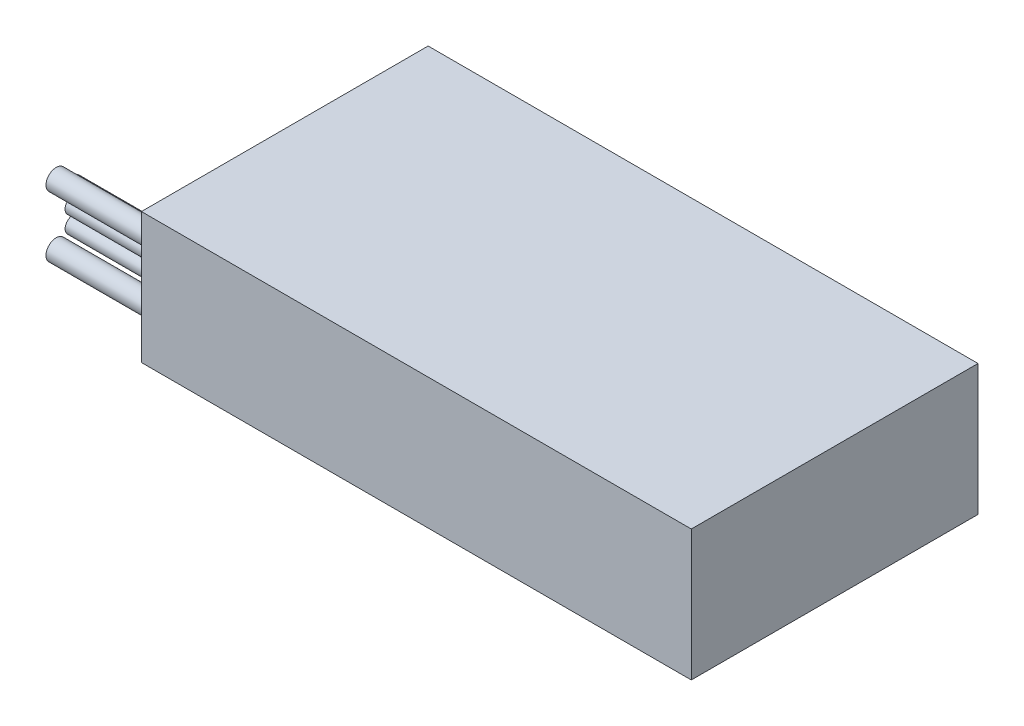
ISO-10303-21;
HEADER;
FILE_DESCRIPTION(('STEP AP214'),'2;1');
FILE_NAME('part.step','',(''),(''),'','','');
FILE_SCHEMA(('AUTOMOTIVE_DESIGN { 1 0 10303 214 1 1 1 1 }'));
ENDSEC;
DATA;
#1=APPLICATION_CONTEXT('core data for automotive mechanical design processes');
#2=APPLICATION_PROTOCOL_DEFINITION('international standard','automotive_design',2000,#1);
#3=PRODUCT_CONTEXT('',#1,'mechanical');
#4=PRODUCT('Part','Part','',(#3));
#5=PRODUCT_RELATED_PRODUCT_CATEGORY('part','',(#4));
#6=PRODUCT_DEFINITION_FORMATION('','',#4);
#7=PRODUCT_DEFINITION_CONTEXT('part definition',#1,'design');
#8=PRODUCT_DEFINITION('design','',#6,#7);
#9=PRODUCT_DEFINITION_SHAPE('','',#8);
#10=(LENGTH_UNIT() NAMED_UNIT(*) SI_UNIT(.MILLI.,.METRE.));
#11=(NAMED_UNIT(*) PLANE_ANGLE_UNIT() SI_UNIT($,.RADIAN.));
#12=(NAMED_UNIT(*) SI_UNIT($,.STERADIAN.) SOLID_ANGLE_UNIT());
#13=UNCERTAINTY_MEASURE_WITH_UNIT(LENGTH_MEASURE(1.E-05),#10,'distance_accuracy_value','');
#14=(GEOMETRIC_REPRESENTATION_CONTEXT(3) GLOBAL_UNCERTAINTY_ASSIGNED_CONTEXT((#13)) GLOBAL_UNIT_ASSIGNED_CONTEXT((#10,
#11,#12)) REPRESENTATION_CONTEXT('',''));
#15=CARTESIAN_POINT('',(0.,0.,0.));
#16=DIRECTION('',(0.,0.,1.));
#17=DIRECTION('',(1.,0.,0.));
#18=AXIS2_PLACEMENT_3D('',#15,#16,#17);
#19=CARTESIAN_POINT('',(0.,0.,35.3));
#20=DIRECTION('',(1.,0.,0.));
#21=DIRECTION('',(0.,0.,-1.));
#22=AXIS2_PLACEMENT_3D('',#19,#20,#21);
#23=PLANE('',#22);
#24=CARTESIAN_POINT('',(0.,11.8,32.8));
#25=DIRECTION('',(1.,0.,0.));
#26=DIRECTION('',(0.,0.,-1.));
#27=AXIS2_PLACEMENT_3D('',#24,#25,#26);
#28=CIRCLE('',#27,1.25);
#29=CARTESIAN_POINT('',(0.,11.8,31.55));
#30=VERTEX_POINT('',#29);
#31=EDGE_CURVE('E11',#30,#30,#28,.F.);
#32=ORIENTED_EDGE('',*,*,#31,.F.);
#33=EDGE_LOOP('',(#32));
#34=FACE_BOUND('',#33,.T.);
#35=CARTESIAN_POINT('',(0.,4.3,32.8));
#36=DIRECTION('',(1.,0.,0.));
#37=DIRECTION('',(0.,0.,-1.));
#38=AXIS2_PLACEMENT_3D('',#35,#36,#37);
#39=CIRCLE('',#38,1.25);
#40=CARTESIAN_POINT('',(0.,4.3,31.55));
#41=VERTEX_POINT('',#40);
#42=EDGE_CURVE('E47',#41,#41,#39,.F.);
#43=ORIENTED_EDGE('',*,*,#42,.F.);
#44=EDGE_LOOP('',(#43));
#45=FACE_BOUND('',#44,.T.);
#46=CARTESIAN_POINT('',(0.,5.95,30.7));
#47=DIRECTION('',(1.,0.,0.));
#48=DIRECTION('',(0.,0.,-1.));
#49=AXIS2_PLACEMENT_3D('',#46,#47,#48);
#50=CIRCLE('',#49,0.999999999999987);
#51=CARTESIAN_POINT('',(0.,5.95,29.7));
#52=VERTEX_POINT('',#51);
#53=EDGE_CURVE('E122',#52,#52,#50,.F.);
#54=ORIENTED_EDGE('',*,*,#53,.F.);
#55=EDGE_LOOP('',(#54));
#56=FACE_BOUND('',#55,.T.);
#57=CARTESIAN_POINT('',(0.,8.05,30.7));
#58=DIRECTION('',(1.,0.,0.));
#59=DIRECTION('',(0.,0.,-1.));
#60=AXIS2_PLACEMENT_3D('',#57,#58,#59);
#61=CIRCLE('',#60,0.999999999999987);
#62=CARTESIAN_POINT('',(0.,8.05,29.7));
#63=VERTEX_POINT('',#62);
#64=EDGE_CURVE('E119',#63,#63,#61,.F.);
#65=ORIENTED_EDGE('',*,*,#64,.F.);
#66=EDGE_LOOP('',(#65));
#67=FACE_BOUND('',#66,.T.);
#68=CARTESIAN_POINT('',(0.,10.15,30.7));
#69=DIRECTION('',(1.,0.,0.));
#70=DIRECTION('',(0.,0.,-1.));
#71=AXIS2_PLACEMENT_3D('',#68,#69,#70);
#72=CIRCLE('',#71,0.999999999999987);
#73=CARTESIAN_POINT('',(0.,10.15,29.7));
#74=VERTEX_POINT('',#73);
#75=EDGE_CURVE('E116',#74,#74,#72,.F.);
#76=ORIENTED_EDGE('',*,*,#75,.F.);
#77=EDGE_LOOP('',(#76));
#78=FACE_BOUND('',#77,.T.);
#79=DIRECTION('',(0.,-1.,0.));
#80=VECTOR('',#79,1.);
#81=CARTESIAN_POINT('',(0.,0.,0.));
#82=LINE('',#81,#80);
#83=CARTESIAN_POINT('',(0.,16.1,0.));
#84=VERTEX_POINT('',#83);
#85=CARTESIAN_POINT('',(0.,0.,0.));
#86=VERTEX_POINT('',#85);
#87=EDGE_CURVE('E106',#84,#86,#82,.T.);
#88=ORIENTED_EDGE('',*,*,#87,.T.);
#89=DIRECTION('',(0.,0.,-1.));
#90=VECTOR('',#89,1.);
#91=CARTESIAN_POINT('',(0.,0.,35.3));
#92=LINE('',#91,#90);
#93=CARTESIAN_POINT('',(0.,0.,35.3));
#94=VERTEX_POINT('',#93);
#95=EDGE_CURVE('E97',#94,#86,#92,.T.);
#96=ORIENTED_EDGE('',*,*,#95,.F.);
#97=DIRECTION('',(0.,-1.,0.));
#98=VECTOR('',#97,1.);
#99=CARTESIAN_POINT('',(0.,0.,35.3));
#100=LINE('',#99,#98);
#101=CARTESIAN_POINT('',(0.,16.1,35.3));
#102=VERTEX_POINT('',#101);
#103=EDGE_CURVE('E91',#102,#94,#100,.T.);
#104=ORIENTED_EDGE('',*,*,#103,.F.);
#105=DIRECTION('',(0.,0.,-1.));
#106=VECTOR('',#105,1.);
#107=CARTESIAN_POINT('',(0.,16.1,35.3));
#108=LINE('',#107,#106);
#109=EDGE_CURVE('E102',#102,#84,#108,.T.);
#110=ORIENTED_EDGE('',*,*,#109,.T.);
#111=EDGE_LOOP('',(#88,#96,#104,#110));
#112=FACE_BOUND('',#111,.T.);
#113=ADVANCED_FACE('F39',(#34,#45,#56,#67,#78,#112),#23,.F.);
#114=CARTESIAN_POINT('',(0.,0.,35.3));
#115=DIRECTION('',(0.,1.,0.));
#116=DIRECTION('',(0.,0.,1.));
#117=AXIS2_PLACEMENT_3D('',#114,#115,#116);
#118=PLANE('',#117);
#119=DIRECTION('',(1.,0.,0.));
#120=VECTOR('',#119,1.);
#121=CARTESIAN_POINT('',(0.,0.,0.));
#122=LINE('',#121,#120);
#123=CARTESIAN_POINT('',(67.7,0.,0.));
#124=VERTEX_POINT('',#123);
#125=EDGE_CURVE('E96',#86,#124,#122,.T.);
#126=ORIENTED_EDGE('',*,*,#125,.T.);
#127=DIRECTION('',(0.,0.,-1.));
#128=VECTOR('',#127,1.);
#129=CARTESIAN_POINT('',(67.7,0.,35.3));
#130=LINE('',#129,#128);
#131=CARTESIAN_POINT('',(67.7,0.,35.3));
#132=VERTEX_POINT('',#131);
#133=EDGE_CURVE('E94',#132,#124,#130,.T.);
#134=ORIENTED_EDGE('',*,*,#133,.F.);
#135=DIRECTION('',(1.,0.,0.));
#136=VECTOR('',#135,1.);
#137=CARTESIAN_POINT('',(0.,0.,35.3));
#138=LINE('',#137,#136);
#139=EDGE_CURVE('E86',#94,#132,#138,.T.);
#140=ORIENTED_EDGE('',*,*,#139,.F.);
#141=ORIENTED_EDGE('',*,*,#95,.T.);
#142=EDGE_LOOP('',(#126,#134,#140,#141));
#143=FACE_BOUND('',#142,.T.);
#144=ADVANCED_FACE('F95',(#143),#118,.F.);
#145=CARTESIAN_POINT('',(67.7,0.,35.3));
#146=DIRECTION('',(-1.,0.,0.));
#147=DIRECTION('',(0.,0.,1.));
#148=AXIS2_PLACEMENT_3D('',#145,#146,#147);
#149=PLANE('',#148);
#150=DIRECTION('',(0.,1.,0.));
#151=VECTOR('',#150,1.);
#152=CARTESIAN_POINT('',(67.7,0.,0.));
#153=LINE('',#152,#151);
#154=CARTESIAN_POINT('',(67.7,16.1,0.));
#155=VERTEX_POINT('',#154);
#156=EDGE_CURVE('E72',#124,#155,#153,.T.);
#157=ORIENTED_EDGE('',*,*,#156,.T.);
#158=DIRECTION('',(0.,0.,-1.));
#159=VECTOR('',#158,1.);
#160=CARTESIAN_POINT('',(67.7,16.1,35.3));
#161=LINE('',#160,#159);
#162=CARTESIAN_POINT('',(67.7,16.1,35.3));
#163=VERTEX_POINT('',#162);
#164=EDGE_CURVE('E98',#163,#155,#161,.T.);
#165=ORIENTED_EDGE('',*,*,#164,.F.);
#166=DIRECTION('',(0.,1.,0.));
#167=VECTOR('',#166,1.);
#168=CARTESIAN_POINT('',(67.7,0.,35.3));
#169=LINE('',#168,#167);
#170=EDGE_CURVE('E89',#132,#163,#169,.T.);
#171=ORIENTED_EDGE('',*,*,#170,.F.);
#172=ORIENTED_EDGE('',*,*,#133,.T.);
#173=EDGE_LOOP('',(#157,#165,#171,#172));
#174=FACE_BOUND('',#173,.T.);
#175=ADVANCED_FACE('F100',(#174),#149,.F.);
#176=CARTESIAN_POINT('',(0.,16.1,35.3));
#177=DIRECTION('',(0.,-1.,0.));
#178=DIRECTION('',(0.,0.,-1.));
#179=AXIS2_PLACEMENT_3D('',#176,#177,#178);
#180=PLANE('',#179);
#181=DIRECTION('',(-1.,0.,0.));
#182=VECTOR('',#181,1.);
#183=CARTESIAN_POINT('',(0.,16.1,0.));
#184=LINE('',#183,#182);
#185=EDGE_CURVE('E78',#155,#84,#184,.T.);
#186=ORIENTED_EDGE('',*,*,#185,.T.);
#187=ORIENTED_EDGE('',*,*,#109,.F.);
#188=DIRECTION('',(-1.,0.,0.));
#189=VECTOR('',#188,1.);
#190=CARTESIAN_POINT('',(0.,16.1,35.3));
#191=LINE('',#190,#189);
#192=EDGE_CURVE('E55',#163,#102,#191,.T.);
#193=ORIENTED_EDGE('',*,*,#192,.F.);
#194=ORIENTED_EDGE('',*,*,#164,.T.);
#195=EDGE_LOOP('',(#186,#187,#193,#194));
#196=FACE_BOUND('',#195,.T.);
#197=ADVANCED_FACE('F151',(#196),#180,.F.);
#198=CARTESIAN_POINT('',(0.,0.,35.3));
#199=DIRECTION('',(0.,0.,-1.));
#200=DIRECTION('',(-1.,0.,0.));
#201=AXIS2_PLACEMENT_3D('',#198,#199,#200);
#202=PLANE('',#201);
#203=ORIENTED_EDGE('',*,*,#103,.T.);
#204=ORIENTED_EDGE('',*,*,#139,.T.);
#205=ORIENTED_EDGE('',*,*,#170,.T.);
#206=ORIENTED_EDGE('',*,*,#192,.T.);
#207=EDGE_LOOP('',(#203,#204,#205,#206));
#208=FACE_BOUND('',#207,.T.);
#209=ADVANCED_FACE('F87',(#208),#202,.F.);
#210=CARTESIAN_POINT('',(0.,0.,0.));
#211=DIRECTION('',(0.,0.,-1.));
#212=DIRECTION('',(-1.,0.,0.));
#213=AXIS2_PLACEMENT_3D('',#210,#211,#212);
#214=PLANE('',#213);
#215=ORIENTED_EDGE('',*,*,#87,.F.);
#216=ORIENTED_EDGE('',*,*,#185,.F.);
#217=ORIENTED_EDGE('',*,*,#156,.F.);
#218=ORIENTED_EDGE('',*,*,#125,.F.);
#219=EDGE_LOOP('',(#215,#216,#217,#218));
#220=FACE_BOUND('',#219,.T.);
#221=ADVANCED_FACE('F140',(#220),#214,.T.);
#222=CARTESIAN_POINT('',(-13.,10.15,30.7));
#223=DIRECTION('',(1.,0.,0.));
#224=DIRECTION('',(0.,0.,-1.));
#225=AXIS2_PLACEMENT_3D('',#222,#223,#224);
#226=CYLINDRICAL_SURFACE('',#225,0.999999999999987);
#227=CARTESIAN_POINT('',(-13.,10.15,30.7));
#228=DIRECTION('',(-1.,0.,0.));
#229=DIRECTION('',(0.,0.,1.));
#230=AXIS2_PLACEMENT_3D('',#227,#228,#229);
#231=CIRCLE('',#230,0.999999999999987);
#232=CARTESIAN_POINT('',(-13.,10.15,29.7));
#233=VERTEX_POINT('',#232);
#234=EDGE_CURVE('E109',#233,#233,#231,.T.);
#235=CARTESIAN_POINT('',(-13.,10.15,29.7));
#236=CARTESIAN_POINT('',(-12.8645833333333,10.15,29.7));
#237=CARTESIAN_POINT('',(-12.7291666666667,10.15,29.7));
#238=CARTESIAN_POINT('',(-12.4583333333333,10.15,29.7));
#239=CARTESIAN_POINT('',(-12.3229166666667,10.15,29.7));
#240=CARTESIAN_POINT('',(-12.0520833333333,10.15,29.7));
#241=CARTESIAN_POINT('',(-11.9166666666667,10.15,29.7));
#242=CARTESIAN_POINT('',(-11.6458333333333,10.15,29.7));
#243=CARTESIAN_POINT('',(-11.5104166666667,10.15,29.7));
#244=CARTESIAN_POINT('',(-11.2395833333333,10.15,29.7));
#245=CARTESIAN_POINT('',(-11.1041666666667,10.15,29.7));
#246=CARTESIAN_POINT('',(-10.8333333333333,10.15,29.7));
#247=CARTESIAN_POINT('',(-10.6979166666667,10.15,29.7));
#248=CARTESIAN_POINT('',(-10.4270833333333,10.15,29.7));
#249=CARTESIAN_POINT('',(-10.2916666666667,10.15,29.7));
#250=CARTESIAN_POINT('',(-10.0208333333333,10.15,29.7));
#251=CARTESIAN_POINT('',(-9.88541666666667,10.15,29.7));
#252=CARTESIAN_POINT('',(-9.61458333333333,10.15,29.7));
#253=CARTESIAN_POINT('',(-9.47916666666667,10.15,29.7));
#254=CARTESIAN_POINT('',(-9.20833333333333,10.15,29.7));
#255=CARTESIAN_POINT('',(-9.07291666666666,10.15,29.7));
#256=CARTESIAN_POINT('',(-8.80208333333333,10.15,29.7));
#257=CARTESIAN_POINT('',(-8.66666666666667,10.15,29.7));
#258=CARTESIAN_POINT('',(-8.39583333333333,10.15,29.7));
#259=CARTESIAN_POINT('',(-8.26041666666667,10.15,29.7));
#260=CARTESIAN_POINT('',(-7.98958333333333,10.15,29.7));
#261=CARTESIAN_POINT('',(-7.85416666666667,10.15,29.7));
#262=CARTESIAN_POINT('',(-7.58333333333333,10.15,29.7));
#263=CARTESIAN_POINT('',(-7.44791666666667,10.15,29.7));
#264=CARTESIAN_POINT('',(-7.17708333333333,10.15,29.7));
#265=CARTESIAN_POINT('',(-7.04166666666667,10.15,29.7));
#266=CARTESIAN_POINT('',(-6.77083333333333,10.15,29.7));
#267=CARTESIAN_POINT('',(-6.63541666666667,10.15,29.7));
#268=CARTESIAN_POINT('',(-6.36458333333333,10.15,29.7));
#269=CARTESIAN_POINT('',(-6.22916666666667,10.15,29.7));
#270=CARTESIAN_POINT('',(-5.95833333333333,10.15,29.7));
#271=CARTESIAN_POINT('',(-5.82291666666667,10.15,29.7));
#272=CARTESIAN_POINT('',(-5.55208333333333,10.15,29.7));
#273=CARTESIAN_POINT('',(-5.41666666666667,10.15,29.7));
#274=CARTESIAN_POINT('',(-5.14583333333333,10.15,29.7));
#275=CARTESIAN_POINT('',(-5.01041666666667,10.15,29.7));
#276=CARTESIAN_POINT('',(-4.73958333333333,10.15,29.7));
#277=CARTESIAN_POINT('',(-4.60416666666667,10.15,29.7));
#278=CARTESIAN_POINT('',(-4.33333333333333,10.15,29.7));
#279=CARTESIAN_POINT('',(-4.19791666666667,10.15,29.7));
#280=CARTESIAN_POINT('',(-3.92708333333333,10.15,29.7));
#281=CARTESIAN_POINT('',(-3.79166666666667,10.15,29.7));
#282=CARTESIAN_POINT('',(-3.52083333333333,10.15,29.7));
#283=CARTESIAN_POINT('',(-3.38541666666667,10.15,29.7));
#284=CARTESIAN_POINT('',(-3.11458333333333,10.15,29.7));
#285=CARTESIAN_POINT('',(-2.97916666666667,10.15,29.7));
#286=CARTESIAN_POINT('',(-2.70833333333333,10.15,29.7));
#287=CARTESIAN_POINT('',(-2.57291666666667,10.15,29.7));
#288=CARTESIAN_POINT('',(-2.30208333333333,10.15,29.7));
#289=CARTESIAN_POINT('',(-2.16666666666667,10.15,29.7));
#290=CARTESIAN_POINT('',(-1.89583333333333,10.15,29.7));
#291=CARTESIAN_POINT('',(-1.76041666666667,10.15,29.7));
#292=CARTESIAN_POINT('',(-1.48958333333333,10.15,29.7));
#293=CARTESIAN_POINT('',(-1.35416666666667,10.15,29.7));
#294=CARTESIAN_POINT('',(-1.08333333333333,10.15,29.7));
#295=CARTESIAN_POINT('',(-0.947916666666667,10.15,29.7));
#296=CARTESIAN_POINT('',(-0.677083333333334,10.15,29.7));
#297=CARTESIAN_POINT('',(-0.541666666666667,10.15,29.7));
#298=CARTESIAN_POINT('',(-0.270833333333334,10.15,29.7));
#299=CARTESIAN_POINT('',(-0.135416666666667,10.15,29.7));
#300=CARTESIAN_POINT('',(0.,10.15,29.7));
#301=B_SPLINE_CURVE_WITH_KNOTS('',3,(#235,#236,#237,#238,#239,#240,#241,#242,#243,#244,#245,
#246,#247,#248,#249,#250,#251,#252,#253,#254,#255,#256,#257,#258,#259,#260,#261,#262,#263,#264,
#265,#266,#267,#268,#269,#270,#271,#272,#273,#274,#275,#276,#277,#278,#279,#280,#281,#282,#283,
#284,#285,#286,#287,#288,#289,#290,#291,#292,#293,#294,#295,#296,#297,#298,#299,#300),
.UNSPECIFIED.,.F.,.F.,(4,2,2,2,2,2,2,2,2,2,2,2,2,2,2,2,2,2,2,2,2,2,2,2,2,2,2,2,2,2,2,2,4),(0.,
0.40625,0.812500000000001,1.21875,1.625,2.03125,2.4375,2.84375,3.25,3.65625,4.0625,4.46875,
4.875,5.28125,5.6875,6.09375,6.5,6.90625,7.3125,7.71875,8.125,8.53125,8.9375,9.34375,9.75,
10.15625,10.5625,10.96875,11.375,11.78125,12.1875,12.59375,13.),.UNSPECIFIED.);
#302=EDGE_CURVE('BSEAM142',#233,#74,#301,.T.);
#303=ORIENTED_EDGE('',*,*,#234,.F.);
#304=ORIENTED_EDGE('',*,*,#75,.T.);
#305=ORIENTED_EDGE('',*,*,#302,.T.);
#306=ORIENTED_EDGE('',*,*,#302,.F.);
#307=EDGE_LOOP('',(#303,#305,#304,#306));
#308=FACE_BOUND('',#307,.T.);
#309=ADVANCED_FACE('F142',(#308),#226,.T.);
#310=CARTESIAN_POINT('',(-13.,10.15,30.7));
#311=DIRECTION('',(-1.,0.,0.));
#312=DIRECTION('',(0.,0.,1.));
#313=AXIS2_PLACEMENT_3D('',#310,#311,#312);
#314=PLANE('',#313);
#315=ORIENTED_EDGE('',*,*,#234,.T.);
#316=EDGE_LOOP('',(#315));
#317=FACE_BOUND('',#316,.T.);
#318=ADVANCED_FACE('F148',(#317),#314,.T.);
#319=CARTESIAN_POINT('',(-13.,8.05,30.7));
#320=DIRECTION('',(1.,0.,0.));
#321=DIRECTION('',(0.,0.,-1.));
#322=AXIS2_PLACEMENT_3D('',#319,#320,#321);
#323=CYLINDRICAL_SURFACE('',#322,0.999999999999987);
#324=CARTESIAN_POINT('',(-13.,8.05,30.7));
#325=DIRECTION('',(-1.,0.,0.));
#326=DIRECTION('',(0.,0.,1.));
#327=AXIS2_PLACEMENT_3D('',#324,#325,#326);
#328=CIRCLE('',#327,0.999999999999987);
#329=CARTESIAN_POINT('',(-13.,8.05,29.7));
#330=VERTEX_POINT('',#329);
#331=EDGE_CURVE('E291',#330,#330,#328,.T.);
#332=CARTESIAN_POINT('',(-13.,8.05,29.7));
#333=CARTESIAN_POINT('',(-12.8645833333333,8.05,29.7));
#334=CARTESIAN_POINT('',(-12.7291666666667,8.05,29.7));
#335=CARTESIAN_POINT('',(-12.4583333333333,8.05,29.7));
#336=CARTESIAN_POINT('',(-12.3229166666667,8.05,29.7));
#337=CARTESIAN_POINT('',(-12.0520833333333,8.05,29.7));
#338=CARTESIAN_POINT('',(-11.9166666666667,8.05,29.7));
#339=CARTESIAN_POINT('',(-11.6458333333333,8.05,29.7));
#340=CARTESIAN_POINT('',(-11.5104166666667,8.05,29.7));
#341=CARTESIAN_POINT('',(-11.2395833333333,8.05,29.7));
#342=CARTESIAN_POINT('',(-11.1041666666667,8.05,29.7));
#343=CARTESIAN_POINT('',(-10.8333333333333,8.05,29.7));
#344=CARTESIAN_POINT('',(-10.6979166666667,8.05,29.7));
#345=CARTESIAN_POINT('',(-10.4270833333333,8.05,29.7));
#346=CARTESIAN_POINT('',(-10.2916666666667,8.05,29.7));
#347=CARTESIAN_POINT('',(-10.0208333333333,8.05,29.7));
#348=CARTESIAN_POINT('',(-9.88541666666667,8.05,29.7));
#349=CARTESIAN_POINT('',(-9.61458333333333,8.05,29.7));
#350=CARTESIAN_POINT('',(-9.47916666666667,8.05,29.7));
#351=CARTESIAN_POINT('',(-9.20833333333333,8.05,29.7));
#352=CARTESIAN_POINT('',(-9.07291666666666,8.05,29.7));
#353=CARTESIAN_POINT('',(-8.80208333333333,8.05,29.7));
#354=CARTESIAN_POINT('',(-8.66666666666667,8.05,29.7));
#355=CARTESIAN_POINT('',(-8.39583333333333,8.05,29.7));
#356=CARTESIAN_POINT('',(-8.26041666666667,8.05,29.7));
#357=CARTESIAN_POINT('',(-7.98958333333333,8.05,29.7));
#358=CARTESIAN_POINT('',(-7.85416666666667,8.05,29.7));
#359=CARTESIAN_POINT('',(-7.58333333333333,8.05,29.7));
#360=CARTESIAN_POINT('',(-7.44791666666667,8.05,29.7));
#361=CARTESIAN_POINT('',(-7.17708333333333,8.05,29.7));
#362=CARTESIAN_POINT('',(-7.04166666666667,8.05,29.7));
#363=CARTESIAN_POINT('',(-6.77083333333333,8.05,29.7));
#364=CARTESIAN_POINT('',(-6.63541666666667,8.05,29.7));
#365=CARTESIAN_POINT('',(-6.36458333333333,8.05,29.7));
#366=CARTESIAN_POINT('',(-6.22916666666667,8.05,29.7));
#367=CARTESIAN_POINT('',(-5.95833333333333,8.05,29.7));
#368=CARTESIAN_POINT('',(-5.82291666666667,8.05,29.7));
#369=CARTESIAN_POINT('',(-5.55208333333333,8.05,29.7));
#370=CARTESIAN_POINT('',(-5.41666666666667,8.05,29.7));
#371=CARTESIAN_POINT('',(-5.14583333333333,8.05,29.7));
#372=CARTESIAN_POINT('',(-5.01041666666667,8.05,29.7));
#373=CARTESIAN_POINT('',(-4.73958333333333,8.05,29.7));
#374=CARTESIAN_POINT('',(-4.60416666666667,8.05,29.7));
#375=CARTESIAN_POINT('',(-4.33333333333333,8.05,29.7));
#376=CARTESIAN_POINT('',(-4.19791666666667,8.05,29.7));
#377=CARTESIAN_POINT('',(-3.92708333333333,8.05,29.7));
#378=CARTESIAN_POINT('',(-3.79166666666667,8.05,29.7));
#379=CARTESIAN_POINT('',(-3.52083333333333,8.05,29.7));
#380=CARTESIAN_POINT('',(-3.38541666666667,8.05,29.7));
#381=CARTESIAN_POINT('',(-3.11458333333333,8.05,29.7));
#382=CARTESIAN_POINT('',(-2.97916666666667,8.05,29.7));
#383=CARTESIAN_POINT('',(-2.70833333333333,8.05,29.7));
#384=CARTESIAN_POINT('',(-2.57291666666667,8.05,29.7));
#385=CARTESIAN_POINT('',(-2.30208333333333,8.05,29.7));
#386=CARTESIAN_POINT('',(-2.16666666666667,8.05,29.7));
#387=CARTESIAN_POINT('',(-1.89583333333333,8.05,29.7));
#388=CARTESIAN_POINT('',(-1.76041666666667,8.05,29.7));
#389=CARTESIAN_POINT('',(-1.48958333333333,8.05,29.7));
#390=CARTESIAN_POINT('',(-1.35416666666667,8.05,29.7));
#391=CARTESIAN_POINT('',(-1.08333333333333,8.05,29.7));
#392=CARTESIAN_POINT('',(-0.947916666666667,8.05,29.7));
#393=CARTESIAN_POINT('',(-0.677083333333334,8.05,29.7));
#394=CARTESIAN_POINT('',(-0.541666666666667,8.05,29.7));
#395=CARTESIAN_POINT('',(-0.270833333333334,8.05,29.7));
#396=CARTESIAN_POINT('',(-0.135416666666667,8.05,29.7));
#397=CARTESIAN_POINT('',(0.,8.05,29.7));
#398=B_SPLINE_CURVE_WITH_KNOTS('',3,(#332,#333,#334,#335,#336,#337,#338,#339,#340,#341,#342,
#343,#344,#345,#346,#347,#348,#349,#350,#351,#352,#353,#354,#355,#356,#357,#358,#359,#360,#361,
#362,#363,#364,#365,#366,#367,#368,#369,#370,#371,#372,#373,#374,#375,#376,#377,#378,#379,#380,
#381,#382,#383,#384,#385,#386,#387,#388,#389,#390,#391,#392,#393,#394,#395,#396,#397),
.UNSPECIFIED.,.F.,.F.,(4,2,2,2,2,2,2,2,2,2,2,2,2,2,2,2,2,2,2,2,2,2,2,2,2,2,2,2,2,2,2,2,4),(0.,
0.40625,0.812500000000001,1.21875,1.625,2.03125,2.4375,2.84375,3.25,3.65625,4.0625,4.46875,
4.875,5.28125,5.6875,6.09375,6.5,6.90625,7.3125,7.71875,8.125,8.53125,8.9375,9.34375,9.75,
10.15625,10.5625,10.96875,11.375,11.78125,12.1875,12.59375,13.),.UNSPECIFIED.);
#399=EDGE_CURVE('BSEAM197',#330,#63,#398,.T.);
#400=ORIENTED_EDGE('',*,*,#331,.F.);
#401=ORIENTED_EDGE('',*,*,#64,.T.);
#402=ORIENTED_EDGE('',*,*,#399,.T.);
#403=ORIENTED_EDGE('',*,*,#399,.F.);
#404=EDGE_LOOP('',(#400,#402,#401,#403));
#405=FACE_BOUND('',#404,.T.);
#406=ADVANCED_FACE('F197',(#405),#323,.T.);
#407=CARTESIAN_POINT('',(-13.,8.05,30.7));
#408=DIRECTION('',(-1.,0.,0.));
#409=DIRECTION('',(0.,0.,1.));
#410=AXIS2_PLACEMENT_3D('',#407,#408,#409);
#411=PLANE('',#410);
#412=ORIENTED_EDGE('',*,*,#331,.T.);
#413=EDGE_LOOP('',(#412));
#414=FACE_BOUND('',#413,.T.);
#415=ADVANCED_FACE('F207',(#414),#411,.T.);
#416=CARTESIAN_POINT('',(-13.,5.95,30.7));
#417=DIRECTION('',(1.,0.,0.));
#418=DIRECTION('',(0.,0.,-1.));
#419=AXIS2_PLACEMENT_3D('',#416,#417,#418);
#420=CYLINDRICAL_SURFACE('',#419,0.999999999999987);
#421=CARTESIAN_POINT('',(-13.,5.95,30.7));
#422=DIRECTION('',(-1.,0.,0.));
#423=DIRECTION('',(0.,0.,1.));
#424=AXIS2_PLACEMENT_3D('',#421,#422,#423);
#425=CIRCLE('',#424,0.999999999999987);
#426=CARTESIAN_POINT('',(-13.,5.95,29.7));
#427=VERTEX_POINT('',#426);
#428=EDGE_CURVE('E286',#427,#427,#425,.T.);
#429=CARTESIAN_POINT('',(-13.,5.95,29.7));
#430=CARTESIAN_POINT('',(-12.8645833333333,5.95,29.7));
#431=CARTESIAN_POINT('',(-12.7291666666667,5.95,29.7));
#432=CARTESIAN_POINT('',(-12.4583333333333,5.95,29.7));
#433=CARTESIAN_POINT('',(-12.3229166666667,5.95,29.7));
#434=CARTESIAN_POINT('',(-12.0520833333333,5.95,29.7));
#435=CARTESIAN_POINT('',(-11.9166666666667,5.95,29.7));
#436=CARTESIAN_POINT('',(-11.6458333333333,5.95,29.7));
#437=CARTESIAN_POINT('',(-11.5104166666667,5.95,29.7));
#438=CARTESIAN_POINT('',(-11.2395833333333,5.95,29.7));
#439=CARTESIAN_POINT('',(-11.1041666666667,5.95,29.7));
#440=CARTESIAN_POINT('',(-10.8333333333333,5.95,29.7));
#441=CARTESIAN_POINT('',(-10.6979166666667,5.95,29.7));
#442=CARTESIAN_POINT('',(-10.4270833333333,5.95,29.7));
#443=CARTESIAN_POINT('',(-10.2916666666667,5.95,29.7));
#444=CARTESIAN_POINT('',(-10.0208333333333,5.95,29.7));
#445=CARTESIAN_POINT('',(-9.88541666666667,5.95,29.7));
#446=CARTESIAN_POINT('',(-9.61458333333333,5.95,29.7));
#447=CARTESIAN_POINT('',(-9.47916666666667,5.95,29.7));
#448=CARTESIAN_POINT('',(-9.20833333333333,5.95,29.7));
#449=CARTESIAN_POINT('',(-9.07291666666666,5.95,29.7));
#450=CARTESIAN_POINT('',(-8.80208333333333,5.95,29.7));
#451=CARTESIAN_POINT('',(-8.66666666666667,5.95,29.7));
#452=CARTESIAN_POINT('',(-8.39583333333333,5.95,29.7));
#453=CARTESIAN_POINT('',(-8.26041666666667,5.95,29.7));
#454=CARTESIAN_POINT('',(-7.98958333333333,5.95,29.7));
#455=CARTESIAN_POINT('',(-7.85416666666667,5.95,29.7));
#456=CARTESIAN_POINT('',(-7.58333333333333,5.95,29.7));
#457=CARTESIAN_POINT('',(-7.44791666666667,5.95,29.7));
#458=CARTESIAN_POINT('',(-7.17708333333333,5.95,29.7));
#459=CARTESIAN_POINT('',(-7.04166666666667,5.95,29.7));
#460=CARTESIAN_POINT('',(-6.77083333333333,5.95,29.7));
#461=CARTESIAN_POINT('',(-6.63541666666667,5.95,29.7));
#462=CARTESIAN_POINT('',(-6.36458333333333,5.95,29.7));
#463=CARTESIAN_POINT('',(-6.22916666666667,5.95,29.7));
#464=CARTESIAN_POINT('',(-5.95833333333333,5.95,29.7));
#465=CARTESIAN_POINT('',(-5.82291666666667,5.95,29.7));
#466=CARTESIAN_POINT('',(-5.55208333333333,5.95,29.7));
#467=CARTESIAN_POINT('',(-5.41666666666667,5.95,29.7));
#468=CARTESIAN_POINT('',(-5.14583333333333,5.95,29.7));
#469=CARTESIAN_POINT('',(-5.01041666666667,5.95,29.7));
#470=CARTESIAN_POINT('',(-4.73958333333333,5.95,29.7));
#471=CARTESIAN_POINT('',(-4.60416666666667,5.95,29.7));
#472=CARTESIAN_POINT('',(-4.33333333333333,5.95,29.7));
#473=CARTESIAN_POINT('',(-4.19791666666667,5.95,29.7));
#474=CARTESIAN_POINT('',(-3.92708333333333,5.95,29.7));
#475=CARTESIAN_POINT('',(-3.79166666666667,5.95,29.7));
#476=CARTESIAN_POINT('',(-3.52083333333333,5.95,29.7));
#477=CARTESIAN_POINT('',(-3.38541666666667,5.95,29.7));
#478=CARTESIAN_POINT('',(-3.11458333333333,5.95,29.7));
#479=CARTESIAN_POINT('',(-2.97916666666667,5.95,29.7));
#480=CARTESIAN_POINT('',(-2.70833333333333,5.95,29.7));
#481=CARTESIAN_POINT('',(-2.57291666666667,5.95,29.7));
#482=CARTESIAN_POINT('',(-2.30208333333333,5.95,29.7));
#483=CARTESIAN_POINT('',(-2.16666666666667,5.95,29.7));
#484=CARTESIAN_POINT('',(-1.89583333333333,5.95,29.7));
#485=CARTESIAN_POINT('',(-1.76041666666667,5.95,29.7));
#486=CARTESIAN_POINT('',(-1.48958333333333,5.95,29.7));
#487=CARTESIAN_POINT('',(-1.35416666666667,5.95,29.7));
#488=CARTESIAN_POINT('',(-1.08333333333333,5.95,29.7));
#489=CARTESIAN_POINT('',(-0.947916666666667,5.95,29.7));
#490=CARTESIAN_POINT('',(-0.677083333333334,5.95,29.7));
#491=CARTESIAN_POINT('',(-0.541666666666667,5.95,29.7));
#492=CARTESIAN_POINT('',(-0.270833333333334,5.95,29.7));
#493=CARTESIAN_POINT('',(-0.135416666666667,5.95,29.7));
#494=CARTESIAN_POINT('',(0.,5.95,29.7));
#495=B_SPLINE_CURVE_WITH_KNOTS('',3,(#429,#430,#431,#432,#433,#434,#435,#436,#437,#438,#439,
#440,#441,#442,#443,#444,#445,#446,#447,#448,#449,#450,#451,#452,#453,#454,#455,#456,#457,#458,
#459,#460,#461,#462,#463,#464,#465,#466,#467,#468,#469,#470,#471,#472,#473,#474,#475,#476,#477,
#478,#479,#480,#481,#482,#483,#484,#485,#486,#487,#488,#489,#490,#491,#492,#493,#494),
.UNSPECIFIED.,.F.,.F.,(4,2,2,2,2,2,2,2,2,2,2,2,2,2,2,2,2,2,2,2,2,2,2,2,2,2,2,2,2,2,2,2,4),(0.,
0.40625,0.812500000000001,1.21875,1.625,2.03125,2.4375,2.84375,3.25,3.65625,4.0625,4.46875,
4.875,5.28125,5.6875,6.09375,6.5,6.90625,7.3125,7.71875,8.125,8.53125,8.9375,9.34375,9.75,
10.15625,10.5625,10.96875,11.375,11.78125,12.1875,12.59375,13.),.UNSPECIFIED.);
#496=EDGE_CURVE('BSEAM217',#427,#52,#495,.T.);
#497=ORIENTED_EDGE('',*,*,#428,.F.);
#498=ORIENTED_EDGE('',*,*,#53,.T.);
#499=ORIENTED_EDGE('',*,*,#496,.T.);
#500=ORIENTED_EDGE('',*,*,#496,.F.);
#501=EDGE_LOOP('',(#497,#499,#498,#500));
#502=FACE_BOUND('',#501,.T.);
#503=ADVANCED_FACE('F217',(#502),#420,.T.);
#504=CARTESIAN_POINT('',(-13.,5.95,30.7));
#505=DIRECTION('',(-1.,0.,0.));
#506=DIRECTION('',(0.,0.,1.));
#507=AXIS2_PLACEMENT_3D('',#504,#505,#506);
#508=PLANE('',#507);
#509=ORIENTED_EDGE('',*,*,#428,.T.);
#510=EDGE_LOOP('',(#509));
#511=FACE_BOUND('',#510,.T.);
#512=ADVANCED_FACE('F227',(#511),#508,.T.);
#513=CARTESIAN_POINT('',(-13.,4.3,32.8));
#514=DIRECTION('',(1.,0.,0.));
#515=DIRECTION('',(0.,0.,-1.));
#516=AXIS2_PLACEMENT_3D('',#513,#514,#515);
#517=CYLINDRICAL_SURFACE('',#516,1.25);
#518=CARTESIAN_POINT('',(-13.,4.3,32.8));
#519=DIRECTION('',(-1.,0.,0.));
#520=DIRECTION('',(0.,0.,1.));
#521=AXIS2_PLACEMENT_3D('',#518,#519,#520);
#522=CIRCLE('',#521,1.25);
#523=CARTESIAN_POINT('',(-13.,4.3,31.55));
#524=VERTEX_POINT('',#523);
#525=EDGE_CURVE('E283',#524,#524,#522,.T.);
#526=CARTESIAN_POINT('',(-13.,4.3,31.55));
#527=CARTESIAN_POINT('',(-12.8645833333333,4.3,31.55));
#528=CARTESIAN_POINT('',(-12.7291666666667,4.3,31.55));
#529=CARTESIAN_POINT('',(-12.4583333333333,4.3,31.55));
#530=CARTESIAN_POINT('',(-12.3229166666667,4.3,31.55));
#531=CARTESIAN_POINT('',(-12.0520833333333,4.3,31.55));
#532=CARTESIAN_POINT('',(-11.9166666666667,4.3,31.55));
#533=CARTESIAN_POINT('',(-11.6458333333333,4.3,31.55));
#534=CARTESIAN_POINT('',(-11.5104166666667,4.3,31.55));
#535=CARTESIAN_POINT('',(-11.2395833333333,4.3,31.55));
#536=CARTESIAN_POINT('',(-11.1041666666667,4.3,31.55));
#537=CARTESIAN_POINT('',(-10.8333333333333,4.3,31.55));
#538=CARTESIAN_POINT('',(-10.6979166666667,4.3,31.55));
#539=CARTESIAN_POINT('',(-10.4270833333333,4.3,31.55));
#540=CARTESIAN_POINT('',(-10.2916666666667,4.3,31.55));
#541=CARTESIAN_POINT('',(-10.0208333333333,4.3,31.55));
#542=CARTESIAN_POINT('',(-9.88541666666667,4.3,31.55));
#543=CARTESIAN_POINT('',(-9.61458333333333,4.3,31.55));
#544=CARTESIAN_POINT('',(-9.47916666666667,4.3,31.55));
#545=CARTESIAN_POINT('',(-9.20833333333333,4.3,31.55));
#546=CARTESIAN_POINT('',(-9.07291666666666,4.3,31.55));
#547=CARTESIAN_POINT('',(-8.80208333333333,4.3,31.55));
#548=CARTESIAN_POINT('',(-8.66666666666667,4.3,31.55));
#549=CARTESIAN_POINT('',(-8.39583333333333,4.3,31.55));
#550=CARTESIAN_POINT('',(-8.26041666666667,4.3,31.55));
#551=CARTESIAN_POINT('',(-7.98958333333333,4.3,31.55));
#552=CARTESIAN_POINT('',(-7.85416666666667,4.3,31.55));
#553=CARTESIAN_POINT('',(-7.58333333333333,4.3,31.55));
#554=CARTESIAN_POINT('',(-7.44791666666667,4.3,31.55));
#555=CARTESIAN_POINT('',(-7.17708333333333,4.3,31.55));
#556=CARTESIAN_POINT('',(-7.04166666666667,4.3,31.55));
#557=CARTESIAN_POINT('',(-6.77083333333333,4.3,31.55));
#558=CARTESIAN_POINT('',(-6.63541666666667,4.3,31.55));
#559=CARTESIAN_POINT('',(-6.36458333333333,4.3,31.55));
#560=CARTESIAN_POINT('',(-6.22916666666667,4.3,31.55));
#561=CARTESIAN_POINT('',(-5.95833333333333,4.3,31.55));
#562=CARTESIAN_POINT('',(-5.82291666666667,4.3,31.55));
#563=CARTESIAN_POINT('',(-5.55208333333333,4.3,31.55));
#564=CARTESIAN_POINT('',(-5.41666666666667,4.3,31.55));
#565=CARTESIAN_POINT('',(-5.14583333333333,4.3,31.55));
#566=CARTESIAN_POINT('',(-5.01041666666667,4.3,31.55));
#567=CARTESIAN_POINT('',(-4.73958333333333,4.3,31.55));
#568=CARTESIAN_POINT('',(-4.60416666666667,4.3,31.55));
#569=CARTESIAN_POINT('',(-4.33333333333333,4.3,31.55));
#570=CARTESIAN_POINT('',(-4.19791666666667,4.3,31.55));
#571=CARTESIAN_POINT('',(-3.92708333333333,4.3,31.55));
#572=CARTESIAN_POINT('',(-3.79166666666667,4.3,31.55));
#573=CARTESIAN_POINT('',(-3.52083333333333,4.3,31.55));
#574=CARTESIAN_POINT('',(-3.38541666666667,4.3,31.55));
#575=CARTESIAN_POINT('',(-3.11458333333333,4.3,31.55));
#576=CARTESIAN_POINT('',(-2.97916666666667,4.3,31.55));
#577=CARTESIAN_POINT('',(-2.70833333333333,4.3,31.55));
#578=CARTESIAN_POINT('',(-2.57291666666667,4.3,31.55));
#579=CARTESIAN_POINT('',(-2.30208333333333,4.3,31.55));
#580=CARTESIAN_POINT('',(-2.16666666666667,4.3,31.55));
#581=CARTESIAN_POINT('',(-1.89583333333333,4.3,31.55));
#582=CARTESIAN_POINT('',(-1.76041666666667,4.3,31.55));
#583=CARTESIAN_POINT('',(-1.48958333333333,4.3,31.55));
#584=CARTESIAN_POINT('',(-1.35416666666667,4.3,31.55));
#585=CARTESIAN_POINT('',(-1.08333333333333,4.3,31.55));
#586=CARTESIAN_POINT('',(-0.947916666666667,4.3,31.55));
#587=CARTESIAN_POINT('',(-0.677083333333334,4.3,31.55));
#588=CARTESIAN_POINT('',(-0.541666666666667,4.3,31.55));
#589=CARTESIAN_POINT('',(-0.270833333333334,4.3,31.55));
#590=CARTESIAN_POINT('',(-0.135416666666667,4.3,31.55));
#591=CARTESIAN_POINT('',(0.,4.3,31.55));
#592=B_SPLINE_CURVE_WITH_KNOTS('',3,(#526,#527,#528,#529,#530,#531,#532,#533,#534,#535,#536,
#537,#538,#539,#540,#541,#542,#543,#544,#545,#546,#547,#548,#549,#550,#551,#552,#553,#554,#555,
#556,#557,#558,#559,#560,#561,#562,#563,#564,#565,#566,#567,#568,#569,#570,#571,#572,#573,#574,
#575,#576,#577,#578,#579,#580,#581,#582,#583,#584,#585,#586,#587,#588,#589,#590,#591),
.UNSPECIFIED.,.F.,.F.,(4,2,2,2,2,2,2,2,2,2,2,2,2,2,2,2,2,2,2,2,2,2,2,2,2,2,2,2,2,2,2,2,4),(0.,
0.40625,0.812500000000001,1.21875,1.625,2.03125,2.4375,2.84375,3.25,3.65625,4.0625,4.46875,
4.875,5.28125,5.6875,6.09375,6.5,6.90625,7.3125,7.71875,8.125,8.53125,8.9375,9.34375,9.75,
10.15625,10.5625,10.96875,11.375,11.78125,12.1875,12.59375,13.),.UNSPECIFIED.);
#593=EDGE_CURVE('BSEAM127',#524,#41,#592,.T.);
#594=ORIENTED_EDGE('',*,*,#525,.F.);
#595=ORIENTED_EDGE('',*,*,#42,.T.);
#596=ORIENTED_EDGE('',*,*,#593,.T.);
#597=ORIENTED_EDGE('',*,*,#593,.F.);
#598=EDGE_LOOP('',(#594,#596,#595,#597));
#599=FACE_BOUND('',#598,.T.);
#600=ADVANCED_FACE('F127',(#599),#517,.T.);
#601=CARTESIAN_POINT('',(-13.,4.3,32.8));
#602=DIRECTION('',(-1.,0.,0.));
#603=DIRECTION('',(0.,0.,1.));
#604=AXIS2_PLACEMENT_3D('',#601,#602,#603);
#605=PLANE('',#604);
#606=ORIENTED_EDGE('',*,*,#525,.T.);
#607=EDGE_LOOP('',(#606));
#608=FACE_BOUND('',#607,.T.);
#609=ADVANCED_FACE('F246',(#608),#605,.T.);
#610=CARTESIAN_POINT('',(-13.,11.8,32.8));
#611=DIRECTION('',(1.,0.,0.));
#612=DIRECTION('',(0.,0.,-1.));
#613=AXIS2_PLACEMENT_3D('',#610,#611,#612);
#614=CYLINDRICAL_SURFACE('',#613,1.25);
#615=CARTESIAN_POINT('',(-13.,11.8,32.8));
#616=DIRECTION('',(-1.,0.,0.));
#617=DIRECTION('',(0.,0.,1.));
#618=AXIS2_PLACEMENT_3D('',#615,#616,#617);
#619=CIRCLE('',#618,1.25);
#620=CARTESIAN_POINT('',(-13.,11.8,31.55));
#621=VERTEX_POINT('',#620);
#622=EDGE_CURVE('E282',#621,#621,#619,.T.);
#623=CARTESIAN_POINT('',(-13.,11.8,31.55));
#624=CARTESIAN_POINT('',(-12.8645833333333,11.8,31.55));
#625=CARTESIAN_POINT('',(-12.7291666666667,11.8,31.55));
#626=CARTESIAN_POINT('',(-12.4583333333333,11.8,31.55));
#627=CARTESIAN_POINT('',(-12.3229166666667,11.8,31.55));
#628=CARTESIAN_POINT('',(-12.0520833333333,11.8,31.55));
#629=CARTESIAN_POINT('',(-11.9166666666667,11.8,31.55));
#630=CARTESIAN_POINT('',(-11.6458333333333,11.8,31.55));
#631=CARTESIAN_POINT('',(-11.5104166666667,11.8,31.55));
#632=CARTESIAN_POINT('',(-11.2395833333333,11.8,31.55));
#633=CARTESIAN_POINT('',(-11.1041666666667,11.8,31.55));
#634=CARTESIAN_POINT('',(-10.8333333333333,11.8,31.55));
#635=CARTESIAN_POINT('',(-10.6979166666667,11.8,31.55));
#636=CARTESIAN_POINT('',(-10.4270833333333,11.8,31.55));
#637=CARTESIAN_POINT('',(-10.2916666666667,11.8,31.55));
#638=CARTESIAN_POINT('',(-10.0208333333333,11.8,31.55));
#639=CARTESIAN_POINT('',(-9.88541666666667,11.8,31.55));
#640=CARTESIAN_POINT('',(-9.61458333333333,11.8,31.55));
#641=CARTESIAN_POINT('',(-9.47916666666667,11.8,31.55));
#642=CARTESIAN_POINT('',(-9.20833333333333,11.8,31.55));
#643=CARTESIAN_POINT('',(-9.07291666666666,11.8,31.55));
#644=CARTESIAN_POINT('',(-8.80208333333333,11.8,31.55));
#645=CARTESIAN_POINT('',(-8.66666666666667,11.8,31.55));
#646=CARTESIAN_POINT('',(-8.39583333333333,11.8,31.55));
#647=CARTESIAN_POINT('',(-8.26041666666667,11.8,31.55));
#648=CARTESIAN_POINT('',(-7.98958333333333,11.8,31.55));
#649=CARTESIAN_POINT('',(-7.85416666666667,11.8,31.55));
#650=CARTESIAN_POINT('',(-7.58333333333333,11.8,31.55));
#651=CARTESIAN_POINT('',(-7.44791666666667,11.8,31.55));
#652=CARTESIAN_POINT('',(-7.17708333333333,11.8,31.55));
#653=CARTESIAN_POINT('',(-7.04166666666667,11.8,31.55));
#654=CARTESIAN_POINT('',(-6.77083333333333,11.8,31.55));
#655=CARTESIAN_POINT('',(-6.63541666666667,11.8,31.55));
#656=CARTESIAN_POINT('',(-6.36458333333333,11.8,31.55));
#657=CARTESIAN_POINT('',(-6.22916666666667,11.8,31.55));
#658=CARTESIAN_POINT('',(-5.95833333333333,11.8,31.55));
#659=CARTESIAN_POINT('',(-5.82291666666667,11.8,31.55));
#660=CARTESIAN_POINT('',(-5.55208333333333,11.8,31.55));
#661=CARTESIAN_POINT('',(-5.41666666666667,11.8,31.55));
#662=CARTESIAN_POINT('',(-5.14583333333333,11.8,31.55));
#663=CARTESIAN_POINT('',(-5.01041666666667,11.8,31.55));
#664=CARTESIAN_POINT('',(-4.73958333333333,11.8,31.55));
#665=CARTESIAN_POINT('',(-4.60416666666667,11.8,31.55));
#666=CARTESIAN_POINT('',(-4.33333333333333,11.8,31.55));
#667=CARTESIAN_POINT('',(-4.19791666666667,11.8,31.55));
#668=CARTESIAN_POINT('',(-3.92708333333333,11.8,31.55));
#669=CARTESIAN_POINT('',(-3.79166666666667,11.8,31.55));
#670=CARTESIAN_POINT('',(-3.52083333333333,11.8,31.55));
#671=CARTESIAN_POINT('',(-3.38541666666667,11.8,31.55));
#672=CARTESIAN_POINT('',(-3.11458333333333,11.8,31.55));
#673=CARTESIAN_POINT('',(-2.97916666666667,11.8,31.55));
#674=CARTESIAN_POINT('',(-2.70833333333333,11.8,31.55));
#675=CARTESIAN_POINT('',(-2.57291666666667,11.8,31.55));
#676=CARTESIAN_POINT('',(-2.30208333333333,11.8,31.55));
#677=CARTESIAN_POINT('',(-2.16666666666667,11.8,31.55));
#678=CARTESIAN_POINT('',(-1.89583333333333,11.8,31.55));
#679=CARTESIAN_POINT('',(-1.76041666666667,11.8,31.55));
#680=CARTESIAN_POINT('',(-1.48958333333333,11.8,31.55));
#681=CARTESIAN_POINT('',(-1.35416666666667,11.8,31.55));
#682=CARTESIAN_POINT('',(-1.08333333333333,11.8,31.55));
#683=CARTESIAN_POINT('',(-0.947916666666667,11.8,31.55));
#684=CARTESIAN_POINT('',(-0.677083333333334,11.8,31.55));
#685=CARTESIAN_POINT('',(-0.541666666666667,11.8,31.55));
#686=CARTESIAN_POINT('',(-0.270833333333334,11.8,31.55));
#687=CARTESIAN_POINT('',(-0.135416666666667,11.8,31.55));
#688=CARTESIAN_POINT('',(0.,11.8,31.55));
#689=B_SPLINE_CURVE_WITH_KNOTS('',3,(#623,#624,#625,#626,#627,#628,#629,#630,#631,#632,#633,
#634,#635,#636,#637,#638,#639,#640,#641,#642,#643,#644,#645,#646,#647,#648,#649,#650,#651,#652,
#653,#654,#655,#656,#657,#658,#659,#660,#661,#662,#663,#664,#665,#666,#667,#668,#669,#670,#671,
#672,#673,#674,#675,#676,#677,#678,#679,#680,#681,#682,#683,#684,#685,#686,#687,#688),
.UNSPECIFIED.,.F.,.F.,(4,2,2,2,2,2,2,2,2,2,2,2,2,2,2,2,2,2,2,2,2,2,2,2,2,2,2,2,2,2,2,2,4),(0.,
0.40625,0.812500000000001,1.21875,1.625,2.03125,2.4375,2.84375,3.25,3.65625,4.0625,4.46875,
4.875,5.28125,5.6875,6.09375,6.5,6.90625,7.3125,7.71875,8.125,8.53125,8.9375,9.34375,9.75,
10.15625,10.5625,10.96875,11.375,11.78125,12.1875,12.59375,13.),.UNSPECIFIED.);
#690=EDGE_CURVE('BSEAM256',#621,#30,#689,.T.);
#691=ORIENTED_EDGE('',*,*,#622,.F.);
#692=ORIENTED_EDGE('',*,*,#31,.T.);
#693=ORIENTED_EDGE('',*,*,#690,.T.);
#694=ORIENTED_EDGE('',*,*,#690,.F.);
#695=EDGE_LOOP('',(#691,#693,#692,#694));
#696=FACE_BOUND('',#695,.T.);
#697=ADVANCED_FACE('F256',(#696),#614,.T.);
#698=CARTESIAN_POINT('',(-13.,11.8,32.8));
#699=DIRECTION('',(-1.,0.,0.));
#700=DIRECTION('',(0.,0.,1.));
#701=AXIS2_PLACEMENT_3D('',#698,#699,#700);
#702=PLANE('',#701);
#703=ORIENTED_EDGE('',*,*,#622,.T.);
#704=EDGE_LOOP('',(#703));
#705=FACE_BOUND('',#704,.T.);
#706=ADVANCED_FACE('F266',(#705),#702,.T.);
#707=CLOSED_SHELL('',(#113,#144,#175,#197,#209,#221,#309,#318,#406,#415,#503,#512,#600,#609,
#697,#706));
#708=MANIFOLD_SOLID_BREP('B2',#707);
#709=ADVANCED_BREP_SHAPE_REPRESENTATION('',(#18,#708),#14);
#710=SHAPE_DEFINITION_REPRESENTATION(#9,#709);
ENDSEC;
END-ISO-10303-21;
